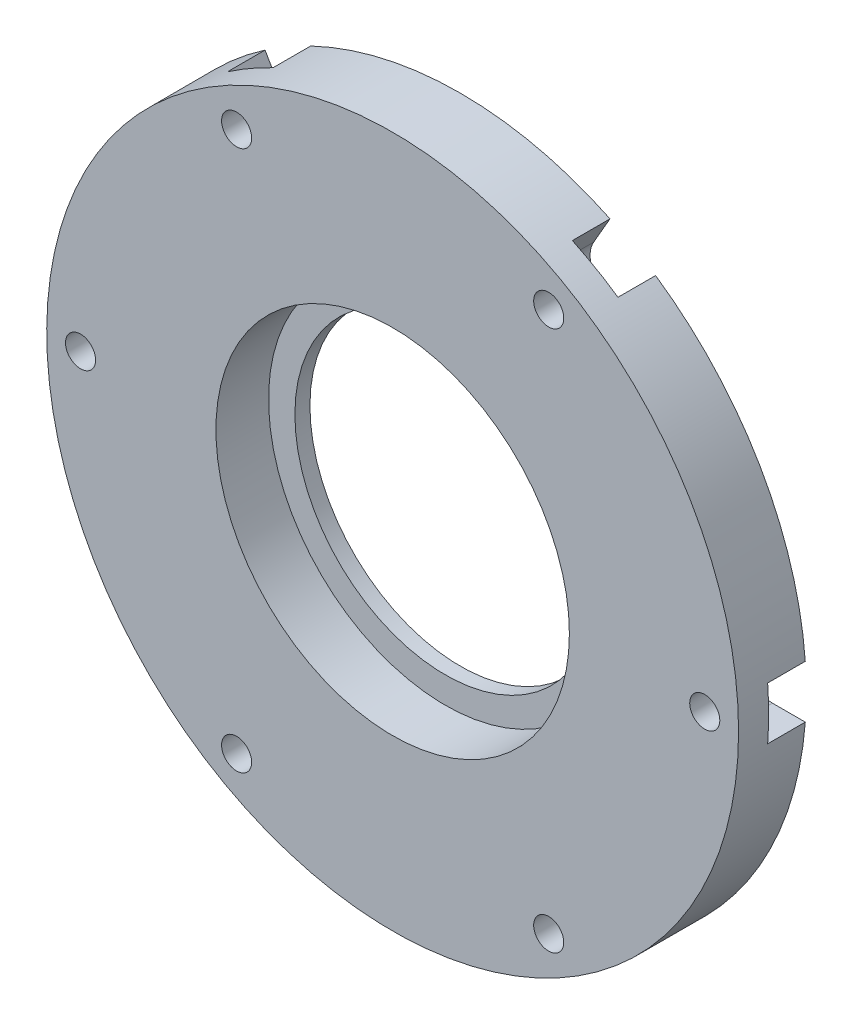
ISO-10303-21;
HEADER;
FILE_DESCRIPTION(('STEP AP214'),'2;1');
FILE_NAME('part.step','',(''),(''),'','','');
FILE_SCHEMA(('AUTOMOTIVE_DESIGN { 1 0 10303 214 1 1 1 1 }'));
ENDSEC;
DATA;
#1=APPLICATION_CONTEXT('core data for automotive mechanical design processes');
#2=APPLICATION_PROTOCOL_DEFINITION('international standard','automotive_design',2000,#1);
#3=PRODUCT_CONTEXT('',#1,'mechanical');
#4=PRODUCT('Part','Part','',(#3));
#5=PRODUCT_RELATED_PRODUCT_CATEGORY('part','',(#4));
#6=PRODUCT_DEFINITION_FORMATION('','',#4);
#7=PRODUCT_DEFINITION_CONTEXT('part definition',#1,'design');
#8=PRODUCT_DEFINITION('design','',#6,#7);
#9=PRODUCT_DEFINITION_SHAPE('','',#8);
#10=(LENGTH_UNIT() NAMED_UNIT(*) SI_UNIT(.MILLI.,.METRE.));
#11=(NAMED_UNIT(*) PLANE_ANGLE_UNIT() SI_UNIT($,.RADIAN.));
#12=(NAMED_UNIT(*) SI_UNIT($,.STERADIAN.) SOLID_ANGLE_UNIT());
#13=UNCERTAINTY_MEASURE_WITH_UNIT(LENGTH_MEASURE(1.E-05),#10,'distance_accuracy_value','');
#14=(GEOMETRIC_REPRESENTATION_CONTEXT(3) GLOBAL_UNCERTAINTY_ASSIGNED_CONTEXT((#13)) GLOBAL_UNIT_ASSIGNED_CONTEXT((#10,
#11,#12)) REPRESENTATION_CONTEXT('',''));
#15=CARTESIAN_POINT('',(0.,0.,0.));
#16=DIRECTION('',(0.,0.,1.));
#17=DIRECTION('',(1.,0.,0.));
#18=AXIS2_PLACEMENT_3D('',#15,#16,#17);
#19=CARTESIAN_POINT('',(0.,0.,0.));
#20=DIRECTION('',(0.,0.,1.));
#21=DIRECTION('',(1.,0.,0.));
#22=AXIS2_PLACEMENT_3D('',#19,#20,#21);
#23=PLANE('',#22);
#24=CARTESIAN_POINT('',(0.,0.,0.));
#25=DIRECTION('',(0.,0.,1.));
#26=DIRECTION('',(1.,0.,0.));
#27=AXIS2_PLACEMENT_3D('',#24,#25,#26);
#28=CIRCLE('',#27,20.);
#29=CARTESIAN_POINT('',(20.,0.,0.));
#30=VERTEX_POINT('',#29);
#31=EDGE_CURVE('E241',#30,#30,#28,.T.);
#32=ORIENTED_EDGE('',*,*,#31,.T.);
#33=EDGE_LOOP('',(#32));
#34=FACE_BOUND('',#33,.T.);
#35=DIRECTION('',(1.,0.,0.));
#36=VECTOR('',#35,1.);
#37=CARTESIAN_POINT('',(0.,-3.5,0.));
#38=LINE('',#37,#36);
#39=CARTESIAN_POINT('',(41.5,-3.49999999999952,0.));
#40=VERTEX_POINT('',#39);
#41=CARTESIAN_POINT('',(45.866654554262,-3.49999999999947,0.));
#42=VERTEX_POINT('',#41);
#43=EDGE_CURVE('E211',#40,#42,#38,.T.);
#44=ORIENTED_EDGE('',*,*,#43,.T.);
#45=CARTESIAN_POINT('',(0.,0.,0.));
#46=DIRECTION('',(0.,0.,1.));
#47=DIRECTION('',(1.,0.,0.));
#48=AXIS2_PLACEMENT_3D('',#45,#46,#47);
#49=CIRCLE('',#48,46.);
#50=CARTESIAN_POINT('',(25.9644161903769,-37.9716880305958,0.));
#51=VERTEX_POINT('',#50);
#52=EDGE_CURVE('E270',#51,#42,#49,.T.);
#53=ORIENTED_EDGE('',*,*,#52,.F.);
#54=DIRECTION('',(0.500000000000009,-0.866025403784434,0.));
#55=VECTOR('',#54,1.);
#56=CARTESIAN_POINT('',(3.03108891324549,1.75000000000002,0.));
#57=LINE('',#56,#55);
#58=CARTESIAN_POINT('',(23.7810889132459,-34.190054257054,0.));
#59=VERTEX_POINT('',#58);
#60=EDGE_CURVE('E674',#59,#51,#57,.T.);
#61=ORIENTED_EDGE('',*,*,#60,.F.);
#62=CARTESIAN_POINT('',(20.75,-35.9400542570542,0.));
#63=DIRECTION('',(0.,0.,-1.));
#64=DIRECTION('',(-1.,0.,0.));
#65=AXIS2_PLACEMENT_3D('',#62,#63,#64);
#66=CIRCLE('',#65,3.5);
#67=CARTESIAN_POINT('',(17.7189110867548,-37.690054257054,0.));
#68=VERTEX_POINT('',#67);
#69=EDGE_CURVE('E225',#68,#59,#66,.T.);
#70=ORIENTED_EDGE('',*,*,#69,.F.);
#71=DIRECTION('',(0.500000000000008,-0.866025403784434,0.));
#72=VECTOR('',#71,1.);
#73=CARTESIAN_POINT('',(-3.03108891324552,-1.75000000000003,0.));
#74=LINE('',#73,#72);
#75=CARTESIAN_POINT('',(19.9022383638858,-41.4716880305959,0.));
#76=VERTEX_POINT('',#75);
#77=EDGE_CURVE('E665',#68,#76,#74,.T.);
#78=ORIENTED_EDGE('',*,*,#77,.T.);
#79=CARTESIAN_POINT('',(-19.9022383638851,-41.4716880305962,0.));
#80=VERTEX_POINT('',#79);
#81=EDGE_CURVE('E831',#80,#76,#49,.T.);
#82=ORIENTED_EDGE('',*,*,#81,.F.);
#83=DIRECTION('',(-0.499999999999994,-0.866025403784442,0.));
#84=VECTOR('',#83,1.);
#85=CARTESIAN_POINT('',(3.03108891324555,-1.74999999999998,0.));
#86=LINE('',#85,#84);
#87=CARTESIAN_POINT('',(-17.7189110867542,-37.6900542570543,0.));
#88=VERTEX_POINT('',#87);
#89=EDGE_CURVE('E678',#88,#80,#86,.T.);
#90=ORIENTED_EDGE('',*,*,#89,.F.);
#91=CARTESIAN_POINT('',(-20.75,-35.9400542570542,0.));
#92=DIRECTION('',(0.,0.,-1.));
#93=DIRECTION('',(-1.,0.,0.));
#94=AXIS2_PLACEMENT_3D('',#91,#92,#93);
#95=CIRCLE('',#94,3.5);
#96=CARTESIAN_POINT('',(-23.7810889132453,-34.1900542570544,0.));
#97=VERTEX_POINT('',#96);
#98=EDGE_CURVE('E796',#97,#88,#95,.T.);
#99=ORIENTED_EDGE('',*,*,#98,.F.);
#100=DIRECTION('',(-0.499999999999994,-0.866025403784442,0.));
#101=VECTOR('',#100,1.);
#102=CARTESIAN_POINT('',(-3.03108891324554,1.74999999999998,0.));
#103=LINE('',#102,#101);
#104=CARTESIAN_POINT('',(-25.9644161903762,-37.9716880305963,0.));
#105=VERTEX_POINT('',#104);
#106=EDGE_CURVE('E766',#97,#105,#103,.T.);
#107=ORIENTED_EDGE('',*,*,#106,.T.);
#108=CARTESIAN_POINT('',(-45.8666545542619,-3.50000000000023,0.));
#109=VERTEX_POINT('',#108);
#110=EDGE_CURVE('E827',#109,#105,#49,.T.);
#111=ORIENTED_EDGE('',*,*,#110,.F.);
#112=DIRECTION('',(-1.,0.,0.));
#113=VECTOR('',#112,1.);
#114=CARTESIAN_POINT('',(0.,-3.50000000000002,0.));
#115=LINE('',#114,#113);
#116=CARTESIAN_POINT('',(-41.5,-3.50000000000021,0.));
#117=VERTEX_POINT('',#116);
#118=EDGE_CURVE('E749',#117,#109,#115,.T.);
#119=ORIENTED_EDGE('',*,*,#118,.F.);
#120=CARTESIAN_POINT('',(-41.5,0.,0.));
#121=DIRECTION('',(0.,0.,-1.));
#122=DIRECTION('',(-1.,0.,0.));
#123=AXIS2_PLACEMENT_3D('',#120,#121,#122);
#124=CIRCLE('',#123,3.5);
#125=CARTESIAN_POINT('',(-41.5,3.4999999999998,0.));
#126=VERTEX_POINT('',#125);
#127=EDGE_CURVE('E790',#126,#117,#124,.T.);
#128=ORIENTED_EDGE('',*,*,#127,.F.);
#129=DIRECTION('',(-1.,0.,0.));
#130=VECTOR('',#129,1.);
#131=CARTESIAN_POINT('',(0.,3.49999999999999,0.));
#132=LINE('',#131,#130);
#133=CARTESIAN_POINT('',(-45.866654554262,3.49999999999978,0.));
#134=VERTEX_POINT('',#133);
#135=EDGE_CURVE('E743',#126,#134,#132,.T.);
#136=ORIENTED_EDGE('',*,*,#135,.T.);
#137=CARTESIAN_POINT('',(-25.9644161903766,37.971688030596,0.));
#138=VERTEX_POINT('',#137);
#139=EDGE_CURVE('E825',#138,#134,#49,.T.);
#140=ORIENTED_EDGE('',*,*,#139,.F.);
#141=DIRECTION('',(-0.5,0.866025403784438,0.));
#142=VECTOR('',#141,1.);
#143=CARTESIAN_POINT('',(-3.03108891324561,-1.75000000000004,0.));
#144=LINE('',#143,#142);
#145=CARTESIAN_POINT('',(-23.7810889132456,34.1900542570541,0.));
#146=VERTEX_POINT('',#145);
#147=EDGE_CURVE('E726',#146,#138,#144,.T.);
#148=ORIENTED_EDGE('',*,*,#147,.F.);
#149=CARTESIAN_POINT('',(-20.75,35.9400542570542,0.));
#150=DIRECTION('',(0.,0.,-1.));
#151=DIRECTION('',(-1.,0.,0.));
#152=AXIS2_PLACEMENT_3D('',#149,#150,#151);
#153=CIRCLE('',#152,3.5);
#154=CARTESIAN_POINT('',(-17.7189110867545,37.6900542570542,0.));
#155=VERTEX_POINT('',#154);
#156=EDGE_CURVE('E784',#155,#146,#153,.T.);
#157=ORIENTED_EDGE('',*,*,#156,.F.);
#158=DIRECTION('',(-0.500000000000002,0.866025403784437,0.));
#159=VECTOR('',#158,1.);
#160=CARTESIAN_POINT('',(3.03108891324554,1.75000000000001,0.));
#161=LINE('',#160,#159);
#162=CARTESIAN_POINT('',(-19.9022383638855,41.471688030596,0.));
#163=VERTEX_POINT('',#162);
#164=EDGE_CURVE('E722',#155,#163,#161,.T.);
#165=ORIENTED_EDGE('',*,*,#164,.T.);
#166=CARTESIAN_POINT('',(19.9022383638854,41.4716880305961,0.));
#167=VERTEX_POINT('',#166);
#168=EDGE_CURVE('E274',#167,#163,#49,.T.);
#169=ORIENTED_EDGE('',*,*,#168,.F.);
#170=DIRECTION('',(0.5,0.866025403784439,0.));
#171=VECTOR('',#170,1.);
#172=CARTESIAN_POINT('',(-3.03108891324553,1.75,0.));
#173=LINE('',#172,#171);
#174=CARTESIAN_POINT('',(17.7189110867545,37.6900542570542,0.));
#175=VERTEX_POINT('',#174);
#176=EDGE_CURVE('E697',#175,#167,#173,.T.);
#177=ORIENTED_EDGE('',*,*,#176,.F.);
#178=CARTESIAN_POINT('',(20.75,35.9400542570542,0.));
#179=DIRECTION('',(0.,0.,-1.));
#180=DIRECTION('',(-1.,0.,0.));
#181=AXIS2_PLACEMENT_3D('',#178,#179,#180);
#182=CIRCLE('',#181,3.5);
#183=CARTESIAN_POINT('',(23.7810889132455,34.1900542570542,0.));
#184=VERTEX_POINT('',#183);
#185=EDGE_CURVE('E237',#184,#175,#182,.T.);
#186=ORIENTED_EDGE('',*,*,#185,.F.);
#187=DIRECTION('',(0.5,0.866025403784439,0.));
#188=VECTOR('',#187,1.);
#189=CARTESIAN_POINT('',(3.03108891324554,-1.75,0.));
#190=LINE('',#189,#188);
#191=CARTESIAN_POINT('',(25.9644161903765,37.9716880305961,0.));
#192=VERTEX_POINT('',#191);
#193=EDGE_CURVE('E703',#184,#192,#190,.T.);
#194=ORIENTED_EDGE('',*,*,#193,.T.);
#195=CARTESIAN_POINT('',(45.8666545542619,3.50000000000054,0.));
#196=VERTEX_POINT('',#195);
#197=EDGE_CURVE('E44',#196,#192,#49,.T.);
#198=ORIENTED_EDGE('',*,*,#197,.F.);
#199=DIRECTION('',(1.,0.,0.));
#200=VECTOR('',#199,1.);
#201=CARTESIAN_POINT('',(0.,3.50000000000001,0.));
#202=LINE('',#201,#200);
#203=CARTESIAN_POINT('',(41.5,3.50000000000049,0.));
#204=VERTEX_POINT('',#203);
#205=EDGE_CURVE('E710',#204,#196,#202,.T.);
#206=ORIENTED_EDGE('',*,*,#205,.F.);
#207=CARTESIAN_POINT('',(41.5,0.,0.));
#208=DIRECTION('',(0.,0.,-1.));
#209=DIRECTION('',(-1.,0.,0.));
#210=AXIS2_PLACEMENT_3D('',#207,#208,#209);
#211=CIRCLE('',#210,3.5);
#212=EDGE_CURVE('E220',#40,#204,#211,.T.);
#213=ORIENTED_EDGE('',*,*,#212,.F.);
#214=EDGE_LOOP('',(#44,#53,#61,#70,#78,#82,#90,#99,#107,#111,#119,#128,#136,#140,#148,#157,#165,
#169,#177,#186,#194,#198,#206,#213));
#215=FACE_BOUND('',#214,.T.);
#216=ADVANCED_FACE('F35',(#34,#215),#23,.F.);
#217=CARTESIAN_POINT('',(0.,0.,9.));
#218=DIRECTION('',(0.,0.,-1.));
#219=DIRECTION('',(-1.,0.,0.));
#220=AXIS2_PLACEMENT_3D('',#217,#218,#219);
#221=CYLINDRICAL_SURFACE('',#220,46.);
#222=CARTESIAN_POINT('',(0.,0.,9.));
#223=DIRECTION('',(0.,0.,1.));
#224=DIRECTION('',(1.,0.,0.));
#225=AXIS2_PLACEMENT_3D('',#222,#223,#224);
#226=CIRCLE('',#225,46.);
#227=CARTESIAN_POINT('',(46.,0.,9.));
#228=VERTEX_POINT('',#227);
#229=EDGE_CURVE('E11',#228,#228,#226,.T.);
#230=ORIENTED_EDGE('',*,*,#229,.F.);
#231=EDGE_LOOP('',(#230));
#232=FACE_BOUND('',#231,.T.);
#233=DIRECTION('',(0.,0.,-1.));
#234=VECTOR('',#233,1.);
#235=CARTESIAN_POINT('',(45.866654554262,-3.49999999999947,5.));
#236=LINE('',#235,#234);
#237=CARTESIAN_POINT('',(45.866654554262,-3.49999999999947,5.));
#238=VERTEX_POINT('',#237);
#239=EDGE_CURVE('E806',#238,#42,#236,.T.);
#240=ORIENTED_EDGE('',*,*,#239,.F.);
#241=CARTESIAN_POINT('',(0.,0.,5.));
#242=DIRECTION('',(0.,0.,-1.));
#243=DIRECTION('',(-1.,0.,0.));
#244=AXIS2_PLACEMENT_3D('',#241,#242,#243);
#245=CIRCLE('',#244,46.);
#246=CARTESIAN_POINT('',(45.8666545542619,3.50000000000054,5.));
#247=VERTEX_POINT('',#246);
#248=EDGE_CURVE('E210',#247,#238,#245,.T.);
#249=ORIENTED_EDGE('',*,*,#248,.F.);
#250=DIRECTION('',(0.,0.,-1.));
#251=VECTOR('',#250,1.);
#252=CARTESIAN_POINT('',(45.8666545542619,3.50000000000054,5.));
#253=LINE('',#252,#251);
#254=EDGE_CURVE('E205',#247,#196,#253,.T.);
#255=ORIENTED_EDGE('',*,*,#254,.T.);
#256=ORIENTED_EDGE('',*,*,#197,.T.);
#257=DIRECTION('',(0.,0.,-1.));
#258=VECTOR('',#257,1.);
#259=CARTESIAN_POINT('',(25.9644161903765,37.9716880305961,5.));
#260=LINE('',#259,#258);
#261=CARTESIAN_POINT('',(25.9644161903765,37.9716880305961,5.));
#262=VERTEX_POINT('',#261);
#263=EDGE_CURVE('E708',#262,#192,#260,.T.);
#264=ORIENTED_EDGE('',*,*,#263,.F.);
#265=CARTESIAN_POINT('',(0.,0.,5.));
#266=DIRECTION('',(0.,0.,-1.));
#267=DIRECTION('',(-1.,0.,0.));
#268=AXIS2_PLACEMENT_3D('',#265,#266,#267);
#269=CIRCLE('',#268,46.);
#270=CARTESIAN_POINT('',(19.9022383638854,41.4716880305961,5.));
#271=VERTEX_POINT('',#270);
#272=EDGE_CURVE('E700',#271,#262,#269,.T.);
#273=ORIENTED_EDGE('',*,*,#272,.F.);
#274=DIRECTION('',(0.,0.,-1.));
#275=VECTOR('',#274,1.);
#276=CARTESIAN_POINT('',(19.9022383638854,41.4716880305961,5.));
#277=LINE('',#276,#275);
#278=EDGE_CURVE('E711',#271,#167,#277,.T.);
#279=ORIENTED_EDGE('',*,*,#278,.T.);
#280=ORIENTED_EDGE('',*,*,#168,.T.);
#281=DIRECTION('',(0.,0.,-1.));
#282=VECTOR('',#281,1.);
#283=CARTESIAN_POINT('',(-19.9022383638855,41.471688030596,5.));
#284=LINE('',#283,#282);
#285=CARTESIAN_POINT('',(-19.9022383638855,41.471688030596,5.));
#286=VERTEX_POINT('',#285);
#287=EDGE_CURVE('E733',#286,#163,#284,.T.);
#288=ORIENTED_EDGE('',*,*,#287,.F.);
#289=CARTESIAN_POINT('',(0.,0.,5.));
#290=DIRECTION('',(0.,0.,-1.));
#291=DIRECTION('',(-1.,0.,0.));
#292=AXIS2_PLACEMENT_3D('',#289,#290,#291);
#293=CIRCLE('',#292,46.);
#294=CARTESIAN_POINT('',(-25.9644161903766,37.971688030596,5.));
#295=VERTEX_POINT('',#294);
#296=EDGE_CURVE('E721',#295,#286,#293,.T.);
#297=ORIENTED_EDGE('',*,*,#296,.F.);
#298=DIRECTION('',(0.,0.,-1.));
#299=VECTOR('',#298,1.);
#300=CARTESIAN_POINT('',(-25.9644161903766,37.971688030596,5.));
#301=LINE('',#300,#299);
#302=EDGE_CURVE('E735',#295,#138,#301,.T.);
#303=ORIENTED_EDGE('',*,*,#302,.T.);
#304=ORIENTED_EDGE('',*,*,#139,.T.);
#305=DIRECTION('',(0.,0.,-1.));
#306=VECTOR('',#305,1.);
#307=CARTESIAN_POINT('',(-45.866654554262,3.49999999999978,5.));
#308=LINE('',#307,#306);
#309=CARTESIAN_POINT('',(-45.866654554262,3.49999999999978,5.));
#310=VERTEX_POINT('',#309);
#311=EDGE_CURVE('E756',#310,#134,#308,.T.);
#312=ORIENTED_EDGE('',*,*,#311,.F.);
#313=CARTESIAN_POINT('',(0.,0.,5.));
#314=DIRECTION('',(0.,0.,-1.));
#315=DIRECTION('',(-1.,0.,0.));
#316=AXIS2_PLACEMENT_3D('',#313,#314,#315);
#317=CIRCLE('',#316,46.);
#318=CARTESIAN_POINT('',(-45.8666545542619,-3.50000000000023,5.));
#319=VERTEX_POINT('',#318);
#320=EDGE_CURVE('E742',#319,#310,#317,.T.);
#321=ORIENTED_EDGE('',*,*,#320,.F.);
#322=DIRECTION('',(0.,0.,-1.));
#323=VECTOR('',#322,1.);
#324=CARTESIAN_POINT('',(-45.8666545542619,-3.50000000000023,5.));
#325=LINE('',#324,#323);
#326=EDGE_CURVE('E758',#319,#109,#325,.T.);
#327=ORIENTED_EDGE('',*,*,#326,.T.);
#328=ORIENTED_EDGE('',*,*,#110,.T.);
#329=DIRECTION('',(0.,0.,-1.));
#330=VECTOR('',#329,1.);
#331=CARTESIAN_POINT('',(-25.9644161903762,-37.9716880305963,5.));
#332=LINE('',#331,#330);
#333=CARTESIAN_POINT('',(-25.9644161903762,-37.9716880305963,5.));
#334=VERTEX_POINT('',#333);
#335=EDGE_CURVE('E777',#334,#105,#332,.T.);
#336=ORIENTED_EDGE('',*,*,#335,.F.);
#337=CARTESIAN_POINT('',(0.,0.,5.));
#338=DIRECTION('',(0.,0.,-1.));
#339=DIRECTION('',(-1.,0.,0.));
#340=AXIS2_PLACEMENT_3D('',#337,#338,#339);
#341=CIRCLE('',#340,46.);
#342=CARTESIAN_POINT('',(-19.9022383638851,-41.4716880305962,5.));
#343=VERTEX_POINT('',#342);
#344=EDGE_CURVE('E765',#343,#334,#341,.T.);
#345=ORIENTED_EDGE('',*,*,#344,.F.);
#346=DIRECTION('',(0.,0.,-1.));
#347=VECTOR('',#346,1.);
#348=CARTESIAN_POINT('',(-19.9022383638851,-41.4716880305962,5.));
#349=LINE('',#348,#347);
#350=EDGE_CURVE('E779',#343,#80,#349,.T.);
#351=ORIENTED_EDGE('',*,*,#350,.T.);
#352=ORIENTED_EDGE('',*,*,#81,.T.);
#353=DIRECTION('',(0.,0.,-1.));
#354=VECTOR('',#353,1.);
#355=CARTESIAN_POINT('',(19.9022383638858,-41.4716880305959,5.));
#356=LINE('',#355,#354);
#357=CARTESIAN_POINT('',(19.9022383638858,-41.4716880305959,5.));
#358=VERTEX_POINT('',#357);
#359=EDGE_CURVE('E669',#358,#76,#356,.T.);
#360=ORIENTED_EDGE('',*,*,#359,.F.);
#361=CARTESIAN_POINT('',(0.,0.,5.));
#362=DIRECTION('',(0.,0.,-1.));
#363=DIRECTION('',(-1.,0.,0.));
#364=AXIS2_PLACEMENT_3D('',#361,#362,#363);
#365=CIRCLE('',#364,46.);
#366=CARTESIAN_POINT('',(25.9644161903769,-37.9716880305958,5.));
#367=VERTEX_POINT('',#366);
#368=EDGE_CURVE('E802',#367,#358,#365,.T.);
#369=ORIENTED_EDGE('',*,*,#368,.F.);
#370=DIRECTION('',(0.,0.,-1.));
#371=VECTOR('',#370,1.);
#372=CARTESIAN_POINT('',(25.9644161903769,-37.9716880305958,5.));
#373=LINE('',#372,#371);
#374=EDGE_CURVE('E691',#367,#51,#373,.T.);
#375=ORIENTED_EDGE('',*,*,#374,.T.);
#376=ORIENTED_EDGE('',*,*,#52,.T.);
#377=EDGE_LOOP('',(#240,#249,#255,#256,#264,#273,#279,#280,#288,#297,#303,#304,#312,#321,#327,
#328,#336,#345,#351,#352,#360,#369,#375,#376));
#378=FACE_BOUND('',#377,.T.);
#379=ADVANCED_FACE('F37',(#232,#378),#221,.T.);
#380=CARTESIAN_POINT('',(20.75,35.9400542570542,5.));
#381=DIRECTION('',(0.,0.,-1.));
#382=DIRECTION('',(-1.,0.,0.));
#383=AXIS2_PLACEMENT_3D('',#380,#381,#382);
#384=CYLINDRICAL_SURFACE('',#383,3.5);
#385=DIRECTION('',(0.,0.,-1.));
#386=VECTOR('',#385,1.);
#387=CARTESIAN_POINT('',(23.7810889132455,34.1900542570542,5.));
#388=LINE('',#387,#386);
#389=CARTESIAN_POINT('',(23.7810889132455,34.1900542570542,5.));
#390=VERTEX_POINT('',#389);
#391=EDGE_CURVE('E702',#390,#184,#388,.T.);
#392=ORIENTED_EDGE('',*,*,#391,.T.);
#393=ORIENTED_EDGE('',*,*,#185,.T.);
#394=DIRECTION('',(0.,0.,-1.));
#395=VECTOR('',#394,1.);
#396=CARTESIAN_POINT('',(17.7189110867545,37.6900542570542,5.));
#397=LINE('',#396,#395);
#398=CARTESIAN_POINT('',(17.7189110867545,37.6900542570542,5.));
#399=VERTEX_POINT('',#398);
#400=EDGE_CURVE('E714',#399,#175,#397,.T.);
#401=ORIENTED_EDGE('',*,*,#400,.F.);
#402=CARTESIAN_POINT('',(20.75,35.9400542570542,5.));
#403=DIRECTION('',(0.,0.,-1.));
#404=DIRECTION('',(-1.,0.,0.));
#405=AXIS2_PLACEMENT_3D('',#402,#403,#404);
#406=CIRCLE('',#405,3.5);
#407=EDGE_CURVE('E234',#390,#399,#406,.T.);
#408=ORIENTED_EDGE('',*,*,#407,.F.);
#409=EDGE_LOOP('',(#392,#393,#401,#408));
#410=FACE_BOUND('',#409,.T.);
#411=ADVANCED_FACE('F314',(#410),#384,.F.);
#412=CARTESIAN_POINT('',(-20.75,35.9400542570542,5.));
#413=DIRECTION('',(0.,0.,-1.));
#414=DIRECTION('',(-1.,0.,0.));
#415=AXIS2_PLACEMENT_3D('',#412,#413,#414);
#416=CYLINDRICAL_SURFACE('',#415,3.5);
#417=DIRECTION('',(0.,0.,-1.));
#418=VECTOR('',#417,1.);
#419=CARTESIAN_POINT('',(-17.7189110867545,37.6900542570542,5.));
#420=LINE('',#419,#418);
#421=CARTESIAN_POINT('',(-17.7189110867546,37.6900542570542,5.));
#422=VERTEX_POINT('',#421);
#423=EDGE_CURVE('E706',#422,#155,#420,.T.);
#424=ORIENTED_EDGE('',*,*,#423,.T.);
#425=ORIENTED_EDGE('',*,*,#156,.T.);
#426=DIRECTION('',(0.,0.,-1.));
#427=VECTOR('',#426,1.);
#428=CARTESIAN_POINT('',(-23.7810889132456,34.1900542570541,5.));
#429=LINE('',#428,#427);
#430=CARTESIAN_POINT('',(-23.7810889132456,34.1900542570541,5.));
#431=VERTEX_POINT('',#430);
#432=EDGE_CURVE('E725',#431,#146,#429,.T.);
#433=ORIENTED_EDGE('',*,*,#432,.F.);
#434=CARTESIAN_POINT('',(-20.75,35.9400542570542,5.));
#435=DIRECTION('',(0.,0.,-1.));
#436=DIRECTION('',(-1.,0.,0.));
#437=AXIS2_PLACEMENT_3D('',#434,#435,#436);
#438=CIRCLE('',#437,3.5);
#439=EDGE_CURVE('E240',#422,#431,#438,.T.);
#440=ORIENTED_EDGE('',*,*,#439,.F.);
#441=EDGE_LOOP('',(#424,#425,#433,#440));
#442=FACE_BOUND('',#441,.T.);
#443=ADVANCED_FACE('F360',(#442),#416,.F.);
#444=CARTESIAN_POINT('',(-41.5,0.,5.));
#445=DIRECTION('',(0.,0.,-1.));
#446=DIRECTION('',(-1.,0.,0.));
#447=AXIS2_PLACEMENT_3D('',#444,#445,#446);
#448=CYLINDRICAL_SURFACE('',#447,3.5);
#449=DIRECTION('',(0.,0.,-1.));
#450=VECTOR('',#449,1.);
#451=CARTESIAN_POINT('',(-41.5,3.4999999999998,5.));
#452=LINE('',#451,#450);
#453=CARTESIAN_POINT('',(-41.5,3.4999999999998,5.));
#454=VERTEX_POINT('',#453);
#455=EDGE_CURVE('E728',#454,#126,#452,.T.);
#456=ORIENTED_EDGE('',*,*,#455,.T.);
#457=ORIENTED_EDGE('',*,*,#127,.T.);
#458=DIRECTION('',(0.,0.,-1.));
#459=VECTOR('',#458,1.);
#460=CARTESIAN_POINT('',(-41.5,-3.50000000000021,5.));
#461=LINE('',#460,#459);
#462=CARTESIAN_POINT('',(-41.5,-3.50000000000021,5.));
#463=VERTEX_POINT('',#462);
#464=EDGE_CURVE('E748',#463,#117,#461,.T.);
#465=ORIENTED_EDGE('',*,*,#464,.F.);
#466=CARTESIAN_POINT('',(-41.5,0.,5.));
#467=DIRECTION('',(0.,0.,-1.));
#468=DIRECTION('',(-1.,0.,0.));
#469=AXIS2_PLACEMENT_3D('',#466,#467,#468);
#470=CIRCLE('',#469,3.5);
#471=EDGE_CURVE('E787',#454,#463,#470,.T.);
#472=ORIENTED_EDGE('',*,*,#471,.F.);
#473=EDGE_LOOP('',(#456,#457,#465,#472));
#474=FACE_BOUND('',#473,.T.);
#475=ADVANCED_FACE('F375',(#474),#448,.F.);
#476=CARTESIAN_POINT('',(-20.75,-35.9400542570542,5.));
#477=DIRECTION('',(0.,0.,-1.));
#478=DIRECTION('',(-1.,0.,0.));
#479=AXIS2_PLACEMENT_3D('',#476,#477,#478);
#480=CYLINDRICAL_SURFACE('',#479,3.5);
#481=DIRECTION('',(0.,0.,-1.));
#482=VECTOR('',#481,1.);
#483=CARTESIAN_POINT('',(-23.7810889132453,-34.1900542570544,5.));
#484=LINE('',#483,#482);
#485=CARTESIAN_POINT('',(-23.7810889132453,-34.1900542570544,5.));
#486=VERTEX_POINT('',#485);
#487=EDGE_CURVE('E751',#486,#97,#484,.T.);
#488=ORIENTED_EDGE('',*,*,#487,.T.);
#489=ORIENTED_EDGE('',*,*,#98,.T.);
#490=DIRECTION('',(0.,0.,-1.));
#491=VECTOR('',#490,1.);
#492=CARTESIAN_POINT('',(-17.7189110867542,-37.6900542570543,5.));
#493=LINE('',#492,#491);
#494=CARTESIAN_POINT('',(-17.7189110867542,-37.6900542570543,5.));
#495=VERTEX_POINT('',#494);
#496=EDGE_CURVE('E771',#495,#88,#493,.T.);
#497=ORIENTED_EDGE('',*,*,#496,.F.);
#498=CARTESIAN_POINT('',(-20.75,-35.9400542570542,5.));
#499=DIRECTION('',(0.,0.,-1.));
#500=DIRECTION('',(-1.,0.,0.));
#501=AXIS2_PLACEMENT_3D('',#498,#499,#500);
#502=CIRCLE('',#501,3.5);
#503=EDGE_CURVE('E793',#486,#495,#502,.T.);
#504=ORIENTED_EDGE('',*,*,#503,.F.);
#505=EDGE_LOOP('',(#488,#489,#497,#504));
#506=FACE_BOUND('',#505,.T.);
#507=ADVANCED_FACE('F370',(#506),#480,.F.);
#508=CARTESIAN_POINT('',(20.75,-35.9400542570542,5.));
#509=DIRECTION('',(0.,0.,-1.));
#510=DIRECTION('',(-1.,0.,0.));
#511=AXIS2_PLACEMENT_3D('',#508,#509,#510);
#512=CYLINDRICAL_SURFACE('',#511,3.5);
#513=DIRECTION('',(0.,0.,-1.));
#514=VECTOR('',#513,1.);
#515=CARTESIAN_POINT('',(17.7189110867548,-37.690054257054,5.));
#516=LINE('',#515,#514);
#517=CARTESIAN_POINT('',(17.7189110867548,-37.690054257054,5.));
#518=VERTEX_POINT('',#517);
#519=EDGE_CURVE('E666',#518,#68,#516,.T.);
#520=ORIENTED_EDGE('',*,*,#519,.T.);
#521=ORIENTED_EDGE('',*,*,#69,.T.);
#522=DIRECTION('',(0.,0.,-1.));
#523=VECTOR('',#522,1.);
#524=CARTESIAN_POINT('',(23.7810889132459,-34.190054257054,5.));
#525=LINE('',#524,#523);
#526=CARTESIAN_POINT('',(23.7810889132459,-34.190054257054,5.));
#527=VERTEX_POINT('',#526);
#528=EDGE_CURVE('E693',#527,#59,#525,.T.);
#529=ORIENTED_EDGE('',*,*,#528,.F.);
#530=CARTESIAN_POINT('',(20.75,-35.9400542570542,5.));
#531=DIRECTION('',(0.,0.,-1.));
#532=DIRECTION('',(-1.,0.,0.));
#533=AXIS2_PLACEMENT_3D('',#530,#531,#532);
#534=CIRCLE('',#533,3.5);
#535=EDGE_CURVE('E228',#518,#527,#534,.T.);
#536=ORIENTED_EDGE('',*,*,#535,.F.);
#537=EDGE_LOOP('',(#520,#521,#529,#536));
#538=FACE_BOUND('',#537,.T.);
#539=ADVANCED_FACE('F366',(#538),#512,.F.);
#540=CARTESIAN_POINT('',(41.5,0.,5.));
#541=DIRECTION('',(0.,0.,-1.));
#542=DIRECTION('',(-1.,0.,0.));
#543=AXIS2_PLACEMENT_3D('',#540,#541,#542);
#544=CYLINDRICAL_SURFACE('',#543,3.5);
#545=DIRECTION('',(0.,0.,-1.));
#546=VECTOR('',#545,1.);
#547=CARTESIAN_POINT('',(41.5,-3.49999999999952,5.));
#548=LINE('',#547,#546);
#549=CARTESIAN_POINT('',(41.5,-3.49999999999952,5.));
#550=VERTEX_POINT('',#549);
#551=EDGE_CURVE('E230',#550,#40,#548,.T.);
#552=ORIENTED_EDGE('',*,*,#551,.T.);
#553=ORIENTED_EDGE('',*,*,#212,.T.);
#554=DIRECTION('',(0.,0.,-1.));
#555=VECTOR('',#554,1.);
#556=CARTESIAN_POINT('',(41.5,3.50000000000049,5.));
#557=LINE('',#556,#555);
#558=CARTESIAN_POINT('',(41.5,3.50000000000049,5.));
#559=VERTEX_POINT('',#558);
#560=EDGE_CURVE('E202',#559,#204,#557,.T.);
#561=ORIENTED_EDGE('',*,*,#560,.F.);
#562=CARTESIAN_POINT('',(41.5,0.,5.));
#563=DIRECTION('',(0.,0.,-1.));
#564=DIRECTION('',(-1.,0.,0.));
#565=AXIS2_PLACEMENT_3D('',#562,#563,#564);
#566=CIRCLE('',#565,3.5);
#567=EDGE_CURVE('E218',#550,#559,#566,.T.);
#568=ORIENTED_EDGE('',*,*,#567,.F.);
#569=EDGE_LOOP('',(#552,#553,#561,#568));
#570=FACE_BOUND('',#569,.T.);
#571=ADVANCED_FACE('F217',(#570),#544,.F.);
#572=CARTESIAN_POINT('',(41.5,0.,9.));
#573=DIRECTION('',(0.,0.,-1.));
#574=DIRECTION('',(-1.,0.,0.));
#575=AXIS2_PLACEMENT_3D('',#572,#573,#574);
#576=CYLINDRICAL_SURFACE('',#575,2.);
#577=CARTESIAN_POINT('',(41.5,0.,9.));
#578=DIRECTION('',(0.,0.,1.));
#579=DIRECTION('',(1.,0.,0.));
#580=AXIS2_PLACEMENT_3D('',#577,#578,#579);
#581=CIRCLE('',#580,2.);
#582=CARTESIAN_POINT('',(43.5,0.,9.));
#583=VERTEX_POINT('',#582);
#584=EDGE_CURVE('E268',#583,#583,#581,.T.);
#585=ORIENTED_EDGE('',*,*,#584,.T.);
#586=EDGE_LOOP('',(#585));
#587=FACE_BOUND('',#586,.T.);
#588=CARTESIAN_POINT('',(41.5,0.,5.));
#589=DIRECTION('',(0.,0.,-1.));
#590=DIRECTION('',(-1.,0.,0.));
#591=AXIS2_PLACEMENT_3D('',#588,#589,#590);
#592=CIRCLE('',#591,2.);
#593=CARTESIAN_POINT('',(39.5,0.,5.));
#594=VERTEX_POINT('',#593);
#595=EDGE_CURVE('E39',#594,#594,#592,.T.);
#596=ORIENTED_EDGE('',*,*,#595,.T.);
#597=EDGE_LOOP('',(#596));
#598=FACE_BOUND('',#597,.T.);
#599=ADVANCED_FACE('F292',(#587,#598),#576,.F.);
#600=CARTESIAN_POINT('',(20.75,-35.9400542570542,9.));
#601=DIRECTION('',(0.,0.,-1.));
#602=DIRECTION('',(-1.,0.,0.));
#603=AXIS2_PLACEMENT_3D('',#600,#601,#602);
#604=CYLINDRICAL_SURFACE('',#603,2.00000000000001);
#605=CARTESIAN_POINT('',(20.75,-35.9400542570542,9.));
#606=DIRECTION('',(0.,0.,1.));
#607=DIRECTION('',(1.,0.,0.));
#608=AXIS2_PLACEMENT_3D('',#605,#606,#607);
#609=CIRCLE('',#608,2.00000000000001);
#610=CARTESIAN_POINT('',(22.75,-35.9400542570542,9.));
#611=VERTEX_POINT('',#610);
#612=EDGE_CURVE('E265',#611,#611,#609,.T.);
#613=ORIENTED_EDGE('',*,*,#612,.T.);
#614=EDGE_LOOP('',(#613));
#615=FACE_BOUND('',#614,.T.);
#616=CARTESIAN_POINT('',(20.75,-35.9400542570542,5.));
#617=DIRECTION('',(0.,0.,-1.));
#618=DIRECTION('',(-1.,0.,0.));
#619=AXIS2_PLACEMENT_3D('',#616,#617,#618);
#620=CIRCLE('',#619,2.00000000000001);
#621=CARTESIAN_POINT('',(18.75,-35.9400542570542,5.));
#622=VERTEX_POINT('',#621);
#623=EDGE_CURVE('E285',#622,#622,#620,.T.);
#624=ORIENTED_EDGE('',*,*,#623,.T.);
#625=EDGE_LOOP('',(#624));
#626=FACE_BOUND('',#625,.T.);
#627=ADVANCED_FACE('F326',(#615,#626),#604,.F.);
#628=CARTESIAN_POINT('',(-20.75,-35.9400542570542,9.));
#629=DIRECTION('',(0.,0.,-1.));
#630=DIRECTION('',(-1.,0.,0.));
#631=AXIS2_PLACEMENT_3D('',#628,#629,#630);
#632=CYLINDRICAL_SURFACE('',#631,2.);
#633=CARTESIAN_POINT('',(-20.75,-35.9400542570542,9.));
#634=DIRECTION('',(0.,0.,1.));
#635=DIRECTION('',(1.,0.,0.));
#636=AXIS2_PLACEMENT_3D('',#633,#634,#635);
#637=CIRCLE('',#636,2.);
#638=CARTESIAN_POINT('',(-18.75,-35.9400542570542,9.));
#639=VERTEX_POINT('',#638);
#640=EDGE_CURVE('E262',#639,#639,#637,.T.);
#641=ORIENTED_EDGE('',*,*,#640,.T.);
#642=EDGE_LOOP('',(#641));
#643=FACE_BOUND('',#642,.T.);
#644=CARTESIAN_POINT('',(-20.75,-35.9400542570542,5.));
#645=DIRECTION('',(0.,0.,-1.));
#646=DIRECTION('',(-1.,0.,0.));
#647=AXIS2_PLACEMENT_3D('',#644,#645,#646);
#648=CIRCLE('',#647,2.);
#649=CARTESIAN_POINT('',(-22.75,-35.9400542570542,5.));
#650=VERTEX_POINT('',#649);
#651=EDGE_CURVE('E283',#650,#650,#648,.T.);
#652=ORIENTED_EDGE('',*,*,#651,.T.);
#653=EDGE_LOOP('',(#652));
#654=FACE_BOUND('',#653,.T.);
#655=ADVANCED_FACE('F330',(#643,#654),#632,.F.);
#656=CARTESIAN_POINT('',(-41.5,0.,9.));
#657=DIRECTION('',(0.,0.,-1.));
#658=DIRECTION('',(-1.,0.,0.));
#659=AXIS2_PLACEMENT_3D('',#656,#657,#658);
#660=CYLINDRICAL_SURFACE('',#659,2.);
#661=CARTESIAN_POINT('',(-41.5,0.,9.));
#662=DIRECTION('',(0.,0.,1.));
#663=DIRECTION('',(1.,0.,0.));
#664=AXIS2_PLACEMENT_3D('',#661,#662,#663);
#665=CIRCLE('',#664,2.);
#666=CARTESIAN_POINT('',(-39.5,0.,9.));
#667=VERTEX_POINT('',#666);
#668=EDGE_CURVE('E259',#667,#667,#665,.T.);
#669=ORIENTED_EDGE('',*,*,#668,.T.);
#670=EDGE_LOOP('',(#669));
#671=FACE_BOUND('',#670,.T.);
#672=CARTESIAN_POINT('',(-41.5,0.,5.));
#673=DIRECTION('',(0.,0.,-1.));
#674=DIRECTION('',(-1.,0.,0.));
#675=AXIS2_PLACEMENT_3D('',#672,#673,#674);
#676=CIRCLE('',#675,2.);
#677=CARTESIAN_POINT('',(-43.5,0.,5.));
#678=VERTEX_POINT('',#677);
#679=EDGE_CURVE('E280',#678,#678,#676,.T.);
#680=ORIENTED_EDGE('',*,*,#679,.T.);
#681=EDGE_LOOP('',(#680));
#682=FACE_BOUND('',#681,.T.);
#683=ADVANCED_FACE('F334',(#671,#682),#660,.F.);
#684=CARTESIAN_POINT('',(-20.75,35.9400542570542,9.));
#685=DIRECTION('',(0.,0.,-1.));
#686=DIRECTION('',(-1.,0.,0.));
#687=AXIS2_PLACEMENT_3D('',#684,#685,#686);
#688=CYLINDRICAL_SURFACE('',#687,2.);
#689=CARTESIAN_POINT('',(-20.75,35.9400542570542,9.));
#690=DIRECTION('',(0.,0.,1.));
#691=DIRECTION('',(1.,0.,0.));
#692=AXIS2_PLACEMENT_3D('',#689,#690,#691);
#693=CIRCLE('',#692,2.);
#694=CARTESIAN_POINT('',(-18.75,35.9400542570542,9.));
#695=VERTEX_POINT('',#694);
#696=EDGE_CURVE('E256',#695,#695,#693,.T.);
#697=ORIENTED_EDGE('',*,*,#696,.T.);
#698=EDGE_LOOP('',(#697));
#699=FACE_BOUND('',#698,.T.);
#700=CARTESIAN_POINT('',(-20.75,35.9400542570542,5.));
#701=DIRECTION('',(0.,0.,-1.));
#702=DIRECTION('',(-1.,0.,0.));
#703=AXIS2_PLACEMENT_3D('',#700,#701,#702);
#704=CIRCLE('',#703,2.);
#705=CARTESIAN_POINT('',(-22.75,35.9400542570542,5.));
#706=VERTEX_POINT('',#705);
#707=EDGE_CURVE('E277',#706,#706,#704,.T.);
#708=ORIENTED_EDGE('',*,*,#707,.T.);
#709=EDGE_LOOP('',(#708));
#710=FACE_BOUND('',#709,.T.);
#711=ADVANCED_FACE('F338',(#699,#710),#688,.F.);
#712=CARTESIAN_POINT('',(20.75,35.9400542570542,9.));
#713=DIRECTION('',(0.,0.,-1.));
#714=DIRECTION('',(-1.,0.,0.));
#715=AXIS2_PLACEMENT_3D('',#712,#713,#714);
#716=CYLINDRICAL_SURFACE('',#715,2.);
#717=CARTESIAN_POINT('',(20.75,35.9400542570542,9.));
#718=DIRECTION('',(0.,0.,1.));
#719=DIRECTION('',(1.,0.,0.));
#720=AXIS2_PLACEMENT_3D('',#717,#718,#719);
#721=CIRCLE('',#720,2.);
#722=CARTESIAN_POINT('',(22.75,35.9400542570542,9.));
#723=VERTEX_POINT('',#722);
#724=EDGE_CURVE('E251',#723,#723,#721,.T.);
#725=ORIENTED_EDGE('',*,*,#724,.T.);
#726=EDGE_LOOP('',(#725));
#727=FACE_BOUND('',#726,.T.);
#728=CARTESIAN_POINT('',(20.75,35.9400542570542,5.));
#729=DIRECTION('',(0.,0.,-1.));
#730=DIRECTION('',(-1.,0.,0.));
#731=AXIS2_PLACEMENT_3D('',#728,#729,#730);
#732=CIRCLE('',#731,2.);
#733=CARTESIAN_POINT('',(18.75,35.9400542570542,5.));
#734=VERTEX_POINT('',#733);
#735=EDGE_CURVE('E236',#734,#734,#732,.T.);
#736=ORIENTED_EDGE('',*,*,#735,.T.);
#737=EDGE_LOOP('',(#736));
#738=FACE_BOUND('',#737,.T.);
#739=ADVANCED_FACE('F322',(#727,#738),#716,.F.);
#740=CARTESIAN_POINT('',(0.,0.,9.));
#741=DIRECTION('',(0.,0.,1.));
#742=DIRECTION('',(1.,0.,0.));
#743=AXIS2_PLACEMENT_3D('',#740,#741,#742);
#744=PLANE('',#743);
#745=CARTESIAN_POINT('',(0.,0.,9.));
#746=DIRECTION('',(0.,0.,1.));
#747=DIRECTION('',(1.,0.,0.));
#748=AXIS2_PLACEMENT_3D('',#745,#746,#747);
#749=CIRCLE('',#748,23.5);
#750=CARTESIAN_POINT('',(23.5,0.,9.));
#751=VERTEX_POINT('',#750);
#752=EDGE_CURVE('E244',#751,#751,#749,.T.);
#753=ORIENTED_EDGE('',*,*,#752,.F.);
#754=EDGE_LOOP('',(#753));
#755=FACE_BOUND('',#754,.T.);
#756=ORIENTED_EDGE('',*,*,#696,.F.);
#757=EDGE_LOOP('',(#756));
#758=FACE_BOUND('',#757,.T.);
#759=ORIENTED_EDGE('',*,*,#640,.F.);
#760=EDGE_LOOP('',(#759));
#761=FACE_BOUND('',#760,.T.);
#762=ORIENTED_EDGE('',*,*,#584,.F.);
#763=EDGE_LOOP('',(#762));
#764=FACE_BOUND('',#763,.T.);
#765=ORIENTED_EDGE('',*,*,#229,.T.);
#766=EDGE_LOOP('',(#765));
#767=FACE_BOUND('',#766,.T.);
#768=ORIENTED_EDGE('',*,*,#612,.F.);
#769=EDGE_LOOP('',(#768));
#770=FACE_BOUND('',#769,.T.);
#771=ORIENTED_EDGE('',*,*,#668,.F.);
#772=EDGE_LOOP('',(#771));
#773=FACE_BOUND('',#772,.T.);
#774=ORIENTED_EDGE('',*,*,#724,.F.);
#775=EDGE_LOOP('',(#774));
#776=FACE_BOUND('',#775,.T.);
#777=ADVANCED_FACE('F318',(#755,#758,#761,#764,#767,#770,#773,#776),#744,.T.);
#778=CARTESIAN_POINT('',(0.,0.,2.));
#779=DIRECTION('',(0.,0.,1.));
#780=DIRECTION('',(1.,0.,0.));
#781=AXIS2_PLACEMENT_3D('',#778,#779,#780);
#782=CYLINDRICAL_SURFACE('',#781,23.5);
#783=CARTESIAN_POINT('',(0.,0.,2.));
#784=DIRECTION('',(0.,0.,1.));
#785=DIRECTION('',(1.,0.,0.));
#786=AXIS2_PLACEMENT_3D('',#783,#784,#785);
#787=CIRCLE('',#786,23.5);
#788=CARTESIAN_POINT('',(23.5,0.,2.));
#789=VERTEX_POINT('',#788);
#790=EDGE_CURVE('E248',#789,#789,#787,.T.);
#791=ORIENTED_EDGE('',*,*,#790,.F.);
#792=EDGE_LOOP('',(#791));
#793=FACE_BOUND('',#792,.T.);
#794=ORIENTED_EDGE('',*,*,#752,.T.);
#795=EDGE_LOOP('',(#794));
#796=FACE_BOUND('',#795,.T.);
#797=ADVANCED_FACE('F321',(#793,#796),#782,.F.);
#798=CARTESIAN_POINT('',(0.,0.,2.));
#799=DIRECTION('',(0.,0.,1.));
#800=DIRECTION('',(1.,0.,0.));
#801=AXIS2_PLACEMENT_3D('',#798,#799,#800);
#802=PLANE('',#801);
#803=CARTESIAN_POINT('',(0.,0.,2.));
#804=DIRECTION('',(0.,0.,1.));
#805=DIRECTION('',(1.,0.,0.));
#806=AXIS2_PLACEMENT_3D('',#803,#804,#805);
#807=CIRCLE('',#806,20.);
#808=CARTESIAN_POINT('',(20.,0.,2.));
#809=VERTEX_POINT('',#808);
#810=EDGE_CURVE('E245',#809,#809,#807,.T.);
#811=ORIENTED_EDGE('',*,*,#810,.F.);
#812=EDGE_LOOP('',(#811));
#813=FACE_BOUND('',#812,.T.);
#814=ORIENTED_EDGE('',*,*,#790,.T.);
#815=EDGE_LOOP('',(#814));
#816=FACE_BOUND('',#815,.T.);
#817=ADVANCED_FACE('F348',(#813,#816),#802,.T.);
#818=CARTESIAN_POINT('',(0.,0.,0.));
#819=DIRECTION('',(0.,0.,1.));
#820=DIRECTION('',(1.,0.,0.));
#821=AXIS2_PLACEMENT_3D('',#818,#819,#820);
#822=CYLINDRICAL_SURFACE('',#821,20.);
#823=ORIENTED_EDGE('',*,*,#31,.F.);
#824=EDGE_LOOP('',(#823));
#825=FACE_BOUND('',#824,.T.);
#826=ORIENTED_EDGE('',*,*,#810,.T.);
#827=EDGE_LOOP('',(#826));
#828=FACE_BOUND('',#827,.T.);
#829=ADVANCED_FACE('F352',(#825,#828),#822,.F.);
#830=CARTESIAN_POINT('',(20.75,35.9400542570542,5.));
#831=DIRECTION('',(0.,0.,-1.));
#832=DIRECTION('',(-1.,0.,0.));
#833=AXIS2_PLACEMENT_3D('',#830,#831,#832);
#834=PLANE('',#833);
#835=ORIENTED_EDGE('',*,*,#735,.F.);
#836=EDGE_LOOP('',(#835));
#837=FACE_BOUND('',#836,.T.);
#838=ORIENTED_EDGE('',*,*,#407,.T.);
#839=DIRECTION('',(0.5,0.866025403784439,0.));
#840=VECTOR('',#839,1.);
#841=CARTESIAN_POINT('',(-3.03108891324553,1.75,5.));
#842=LINE('',#841,#840);
#843=EDGE_CURVE('E696',#399,#271,#842,.T.);
#844=ORIENTED_EDGE('',*,*,#843,.T.);
#845=ORIENTED_EDGE('',*,*,#272,.T.);
#846=DIRECTION('',(0.5,0.866025403784439,0.));
#847=VECTOR('',#846,1.);
#848=CARTESIAN_POINT('',(3.03108891324554,-1.75,5.));
#849=LINE('',#848,#847);
#850=EDGE_CURVE('E52',#390,#262,#849,.T.);
#851=ORIENTED_EDGE('',*,*,#850,.F.);
#852=EDGE_LOOP('',(#838,#844,#845,#851));
#853=FACE_BOUND('',#852,.T.);
#854=ADVANCED_FACE('F356',(#837,#853),#834,.T.);
#855=CARTESIAN_POINT('',(-20.75,35.9400542570542,5.));
#856=DIRECTION('',(0.,0.,-1.));
#857=DIRECTION('',(-1.,0.,0.));
#858=AXIS2_PLACEMENT_3D('',#855,#856,#857);
#859=PLANE('',#858);
#860=ORIENTED_EDGE('',*,*,#707,.F.);
#861=EDGE_LOOP('',(#860));
#862=FACE_BOUND('',#861,.T.);
#863=ORIENTED_EDGE('',*,*,#439,.T.);
#864=DIRECTION('',(-0.5,0.866025403784438,0.));
#865=VECTOR('',#864,1.);
#866=CARTESIAN_POINT('',(-3.03108891324561,-1.75000000000004,5.));
#867=LINE('',#866,#865);
#868=EDGE_CURVE('E718',#431,#295,#867,.T.);
#869=ORIENTED_EDGE('',*,*,#868,.T.);
#870=ORIENTED_EDGE('',*,*,#296,.T.);
#871=DIRECTION('',(-0.500000000000002,0.866025403784437,0.));
#872=VECTOR('',#871,1.);
#873=CARTESIAN_POINT('',(3.03108891324554,1.75000000000001,5.));
#874=LINE('',#873,#872);
#875=EDGE_CURVE('E60',#422,#286,#874,.T.);
#876=ORIENTED_EDGE('',*,*,#875,.F.);
#877=EDGE_LOOP('',(#863,#869,#870,#876));
#878=FACE_BOUND('',#877,.T.);
#879=ADVANCED_FACE('F363',(#862,#878),#859,.T.);
#880=CARTESIAN_POINT('',(-41.5,0.,5.));
#881=DIRECTION('',(0.,0.,-1.));
#882=DIRECTION('',(-1.,0.,0.));
#883=AXIS2_PLACEMENT_3D('',#880,#881,#882);
#884=PLANE('',#883);
#885=ORIENTED_EDGE('',*,*,#679,.F.);
#886=EDGE_LOOP('',(#885));
#887=FACE_BOUND('',#886,.T.);
#888=ORIENTED_EDGE('',*,*,#471,.T.);
#889=DIRECTION('',(-1.,0.,0.));
#890=VECTOR('',#889,1.);
#891=CARTESIAN_POINT('',(0.,-3.50000000000002,5.));
#892=LINE('',#891,#890);
#893=EDGE_CURVE('E739',#463,#319,#892,.T.);
#894=ORIENTED_EDGE('',*,*,#893,.T.);
#895=ORIENTED_EDGE('',*,*,#320,.T.);
#896=DIRECTION('',(-1.,0.,0.));
#897=VECTOR('',#896,1.);
#898=CARTESIAN_POINT('',(0.,3.49999999999999,5.));
#899=LINE('',#898,#897);
#900=EDGE_CURVE('E746',#454,#310,#899,.T.);
#901=ORIENTED_EDGE('',*,*,#900,.F.);
#902=EDGE_LOOP('',(#888,#894,#895,#901));
#903=FACE_BOUND('',#902,.T.);
#904=ADVANCED_FACE('F382',(#887,#903),#884,.T.);
#905=CARTESIAN_POINT('',(-20.75,-35.9400542570542,5.));
#906=DIRECTION('',(0.,0.,-1.));
#907=DIRECTION('',(-1.,0.,0.));
#908=AXIS2_PLACEMENT_3D('',#905,#906,#907);
#909=PLANE('',#908);
#910=ORIENTED_EDGE('',*,*,#651,.F.);
#911=EDGE_LOOP('',(#910));
#912=FACE_BOUND('',#911,.T.);
#913=ORIENTED_EDGE('',*,*,#503,.T.);
#914=DIRECTION('',(-0.499999999999994,-0.866025403784442,0.));
#915=VECTOR('',#914,1.);
#916=CARTESIAN_POINT('',(3.03108891324555,-1.74999999999998,5.));
#917=LINE('',#916,#915);
#918=EDGE_CURVE('E762',#495,#343,#917,.T.);
#919=ORIENTED_EDGE('',*,*,#918,.T.);
#920=ORIENTED_EDGE('',*,*,#344,.T.);
#921=DIRECTION('',(-0.499999999999994,-0.866025403784442,0.));
#922=VECTOR('',#921,1.);
#923=CARTESIAN_POINT('',(-3.03108891324554,1.74999999999998,5.));
#924=LINE('',#923,#922);
#925=EDGE_CURVE('E769',#486,#334,#924,.T.);
#926=ORIENTED_EDGE('',*,*,#925,.F.);
#927=EDGE_LOOP('',(#913,#919,#920,#926));
#928=FACE_BOUND('',#927,.T.);
#929=ADVANCED_FACE('F304',(#912,#928),#909,.T.);
#930=CARTESIAN_POINT('',(20.75,-35.9400542570542,5.));
#931=DIRECTION('',(0.,0.,-1.));
#932=DIRECTION('',(-1.,0.,0.));
#933=AXIS2_PLACEMENT_3D('',#930,#931,#932);
#934=PLANE('',#933);
#935=ORIENTED_EDGE('',*,*,#623,.F.);
#936=EDGE_LOOP('',(#935));
#937=FACE_BOUND('',#936,.T.);
#938=ORIENTED_EDGE('',*,*,#535,.T.);
#939=DIRECTION('',(0.500000000000009,-0.866025403784434,0.));
#940=VECTOR('',#939,1.);
#941=CARTESIAN_POINT('',(3.03108891324549,1.75000000000002,5.));
#942=LINE('',#941,#940);
#943=EDGE_CURVE('E673',#527,#367,#942,.T.);
#944=ORIENTED_EDGE('',*,*,#943,.T.);
#945=ORIENTED_EDGE('',*,*,#368,.T.);
#946=DIRECTION('',(0.500000000000008,-0.866025403784434,0.));
#947=VECTOR('',#946,1.);
#948=CARTESIAN_POINT('',(-3.03108891324552,-1.75000000000003,5.));
#949=LINE('',#948,#947);
#950=EDGE_CURVE('E687',#518,#358,#949,.T.);
#951=ORIENTED_EDGE('',*,*,#950,.F.);
#952=EDGE_LOOP('',(#938,#944,#945,#951));
#953=FACE_BOUND('',#952,.T.);
#954=ADVANCED_FACE('F296',(#937,#953),#934,.T.);
#955=CARTESIAN_POINT('',(41.5,0.,5.));
#956=DIRECTION('',(0.,0.,-1.));
#957=DIRECTION('',(-1.,0.,0.));
#958=AXIS2_PLACEMENT_3D('',#955,#956,#957);
#959=PLANE('',#958);
#960=ORIENTED_EDGE('',*,*,#595,.F.);
#961=EDGE_LOOP('',(#960));
#962=FACE_BOUND('',#961,.T.);
#963=ORIENTED_EDGE('',*,*,#567,.T.);
#964=DIRECTION('',(1.,0.,0.));
#965=VECTOR('',#964,1.);
#966=CARTESIAN_POINT('',(0.,3.50000000000001,5.));
#967=LINE('',#966,#965);
#968=EDGE_CURVE('E199',#559,#247,#967,.T.);
#969=ORIENTED_EDGE('',*,*,#968,.T.);
#970=ORIENTED_EDGE('',*,*,#248,.T.);
#971=DIRECTION('',(1.,0.,0.));
#972=VECTOR('',#971,1.);
#973=CARTESIAN_POINT('',(0.,-3.5,5.));
#974=LINE('',#973,#972);
#975=EDGE_CURVE('E221',#550,#238,#974,.T.);
#976=ORIENTED_EDGE('',*,*,#975,.F.);
#977=EDGE_LOOP('',(#963,#969,#970,#976));
#978=FACE_BOUND('',#977,.T.);
#979=ADVANCED_FACE('F223',(#962,#978),#959,.T.);
#980=CARTESIAN_POINT('',(0.,-3.5,5.));
#981=DIRECTION('',(0.,1.,0.));
#982=DIRECTION('',(-1.,0.,0.));
#983=AXIS2_PLACEMENT_3D('',#980,#981,#982);
#984=PLANE('',#983);
#985=ORIENTED_EDGE('',*,*,#43,.F.);
#986=ORIENTED_EDGE('',*,*,#551,.F.);
#987=ORIENTED_EDGE('',*,*,#975,.T.);
#988=ORIENTED_EDGE('',*,*,#239,.T.);
#989=EDGE_LOOP('',(#985,#986,#987,#988));
#990=FACE_BOUND('',#989,.T.);
#991=ADVANCED_FACE('F295',(#990),#984,.T.);
#992=CARTESIAN_POINT('',(0.,3.50000000000001,5.));
#993=DIRECTION('',(0.,1.,0.));
#994=DIRECTION('',(-1.,0.,0.));
#995=AXIS2_PLACEMENT_3D('',#992,#993,#994);
#996=PLANE('',#995);
#997=ORIENTED_EDGE('',*,*,#205,.T.);
#998=ORIENTED_EDGE('',*,*,#254,.F.);
#999=ORIENTED_EDGE('',*,*,#968,.F.);
#1000=ORIENTED_EDGE('',*,*,#560,.T.);
#1001=EDGE_LOOP('',(#997,#998,#999,#1000));
#1002=FACE_BOUND('',#1001,.T.);
#1003=ADVANCED_FACE('F201',(#1002),#996,.F.);
#1004=CARTESIAN_POINT('',(-3.03108891324552,-1.75000000000003,5.));
#1005=DIRECTION('',(0.866025403784434,0.500000000000008,0.));
#1006=DIRECTION('',(-0.500000000000008,0.866025403784434,0.));
#1007=AXIS2_PLACEMENT_3D('',#1004,#1005,#1006);
#1008=PLANE('',#1007);
#1009=ORIENTED_EDGE('',*,*,#77,.F.);
#1010=ORIENTED_EDGE('',*,*,#519,.F.);
#1011=ORIENTED_EDGE('',*,*,#950,.T.);
#1012=ORIENTED_EDGE('',*,*,#359,.T.);
#1013=EDGE_LOOP('',(#1009,#1010,#1011,#1012));
#1014=FACE_BOUND('',#1013,.T.);
#1015=ADVANCED_FACE('F431',(#1014),#1008,.T.);
#1016=CARTESIAN_POINT('',(3.03108891324549,1.75000000000002,5.));
#1017=DIRECTION('',(0.866025403784434,0.500000000000009,0.));
#1018=DIRECTION('',(-0.500000000000009,0.866025403784434,0.));
#1019=AXIS2_PLACEMENT_3D('',#1016,#1017,#1018);
#1020=PLANE('',#1019);
#1021=ORIENTED_EDGE('',*,*,#60,.T.);
#1022=ORIENTED_EDGE('',*,*,#374,.F.);
#1023=ORIENTED_EDGE('',*,*,#943,.F.);
#1024=ORIENTED_EDGE('',*,*,#528,.T.);
#1025=EDGE_LOOP('',(#1021,#1022,#1023,#1024));
#1026=FACE_BOUND('',#1025,.T.);
#1027=ADVANCED_FACE('F404',(#1026),#1020,.F.);
#1028=CARTESIAN_POINT('',(-3.03108891324554,1.74999999999998,5.));
#1029=DIRECTION('',(0.866025403784442,-0.499999999999994,0.));
#1030=DIRECTION('',(0.499999999999994,0.866025403784442,0.));
#1031=AXIS2_PLACEMENT_3D('',#1028,#1029,#1030);
#1032=PLANE('',#1031);
#1033=ORIENTED_EDGE('',*,*,#106,.F.);
#1034=ORIENTED_EDGE('',*,*,#487,.F.);
#1035=ORIENTED_EDGE('',*,*,#925,.T.);
#1036=ORIENTED_EDGE('',*,*,#335,.T.);
#1037=EDGE_LOOP('',(#1033,#1034,#1035,#1036));
#1038=FACE_BOUND('',#1037,.T.);
#1039=ADVANCED_FACE('F400',(#1038),#1032,.T.);
#1040=CARTESIAN_POINT('',(3.03108891324555,-1.74999999999998,5.));
#1041=DIRECTION('',(0.866025403784442,-0.499999999999994,0.));
#1042=DIRECTION('',(0.499999999999994,0.866025403784442,0.));
#1043=AXIS2_PLACEMENT_3D('',#1040,#1041,#1042);
#1044=PLANE('',#1043);
#1045=ORIENTED_EDGE('',*,*,#89,.T.);
#1046=ORIENTED_EDGE('',*,*,#350,.F.);
#1047=ORIENTED_EDGE('',*,*,#918,.F.);
#1048=ORIENTED_EDGE('',*,*,#496,.T.);
#1049=EDGE_LOOP('',(#1045,#1046,#1047,#1048));
#1050=FACE_BOUND('',#1049,.T.);
#1051=ADVANCED_FACE('F396',(#1050),#1044,.F.);
#1052=CARTESIAN_POINT('',(0.,3.49999999999999,5.));
#1053=DIRECTION('',(0.,-1.,0.));
#1054=DIRECTION('',(1.,0.,0.));
#1055=AXIS2_PLACEMENT_3D('',#1052,#1053,#1054);
#1056=PLANE('',#1055);
#1057=ORIENTED_EDGE('',*,*,#135,.F.);
#1058=ORIENTED_EDGE('',*,*,#455,.F.);
#1059=ORIENTED_EDGE('',*,*,#900,.T.);
#1060=ORIENTED_EDGE('',*,*,#311,.T.);
#1061=EDGE_LOOP('',(#1057,#1058,#1059,#1060));
#1062=FACE_BOUND('',#1061,.T.);
#1063=ADVANCED_FACE('F399',(#1062),#1056,.T.);
#1064=CARTESIAN_POINT('',(0.,-3.50000000000002,5.));
#1065=DIRECTION('',(0.,-1.,0.));
#1066=DIRECTION('',(1.,0.,0.));
#1067=AXIS2_PLACEMENT_3D('',#1064,#1065,#1066);
#1068=PLANE('',#1067);
#1069=ORIENTED_EDGE('',*,*,#118,.T.);
#1070=ORIENTED_EDGE('',*,*,#326,.F.);
#1071=ORIENTED_EDGE('',*,*,#893,.F.);
#1072=ORIENTED_EDGE('',*,*,#464,.T.);
#1073=EDGE_LOOP('',(#1069,#1070,#1071,#1072));
#1074=FACE_BOUND('',#1073,.T.);
#1075=ADVANCED_FACE('F406',(#1074),#1068,.F.);
#1076=CARTESIAN_POINT('',(3.03108891324554,1.75000000000001,5.));
#1077=DIRECTION('',(-0.866025403784437,-0.500000000000002,0.));
#1078=DIRECTION('',(0.500000000000002,-0.866025403784437,0.));
#1079=AXIS2_PLACEMENT_3D('',#1076,#1077,#1078);
#1080=PLANE('',#1079);
#1081=ORIENTED_EDGE('',*,*,#164,.F.);
#1082=ORIENTED_EDGE('',*,*,#423,.F.);
#1083=ORIENTED_EDGE('',*,*,#875,.T.);
#1084=ORIENTED_EDGE('',*,*,#287,.T.);
#1085=EDGE_LOOP('',(#1081,#1082,#1083,#1084));
#1086=FACE_BOUND('',#1085,.T.);
#1087=ADVANCED_FACE('F409',(#1086),#1080,.T.);
#1088=CARTESIAN_POINT('',(-3.03108891324561,-1.75000000000004,5.));
#1089=DIRECTION('',(-0.866025403784438,-0.5,0.));
#1090=DIRECTION('',(0.5,-0.866025403784438,0.));
#1091=AXIS2_PLACEMENT_3D('',#1088,#1089,#1090);
#1092=PLANE('',#1091);
#1093=ORIENTED_EDGE('',*,*,#147,.T.);
#1094=ORIENTED_EDGE('',*,*,#302,.F.);
#1095=ORIENTED_EDGE('',*,*,#868,.F.);
#1096=ORIENTED_EDGE('',*,*,#432,.T.);
#1097=EDGE_LOOP('',(#1093,#1094,#1095,#1096));
#1098=FACE_BOUND('',#1097,.T.);
#1099=ADVANCED_FACE('F414',(#1098),#1092,.F.);
#1100=CARTESIAN_POINT('',(3.03108891324554,-1.75,5.));
#1101=DIRECTION('',(-0.866025403784439,0.5,0.));
#1102=DIRECTION('',(-0.5,-0.866025403784439,0.));
#1103=AXIS2_PLACEMENT_3D('',#1100,#1101,#1102);
#1104=PLANE('',#1103);
#1105=ORIENTED_EDGE('',*,*,#193,.F.);
#1106=ORIENTED_EDGE('',*,*,#391,.F.);
#1107=ORIENTED_EDGE('',*,*,#850,.T.);
#1108=ORIENTED_EDGE('',*,*,#263,.T.);
#1109=EDGE_LOOP('',(#1105,#1106,#1107,#1108));
#1110=FACE_BOUND('',#1109,.T.);
#1111=ADVANCED_FACE('F417',(#1110),#1104,.T.);
#1112=CARTESIAN_POINT('',(-3.03108891324553,1.75,5.));
#1113=DIRECTION('',(-0.866025403784439,0.5,0.));
#1114=DIRECTION('',(-0.5,-0.866025403784439,0.));
#1115=AXIS2_PLACEMENT_3D('',#1112,#1113,#1114);
#1116=PLANE('',#1115);
#1117=ORIENTED_EDGE('',*,*,#176,.T.);
#1118=ORIENTED_EDGE('',*,*,#278,.F.);
#1119=ORIENTED_EDGE('',*,*,#843,.F.);
#1120=ORIENTED_EDGE('',*,*,#400,.T.);
#1121=EDGE_LOOP('',(#1117,#1118,#1119,#1120));
#1122=FACE_BOUND('',#1121,.T.);
#1123=ADVANCED_FACE('F424',(#1122),#1116,.F.);
#1124=CLOSED_SHELL('',(#216,#379,#411,#443,#475,#507,#539,#571,#599,#627,#655,#683,#711,#739,
#777,#797,#817,#829,#854,#879,#904,#929,#954,#979,#991,#1003,#1015,#1027,#1039,#1051,#1063,
#1075,#1087,#1099,#1111,#1123));
#1125=MANIFOLD_SOLID_BREP('B2',#1124);
#1126=ADVANCED_BREP_SHAPE_REPRESENTATION('',(#18,#1125),#14);
#1127=SHAPE_DEFINITION_REPRESENTATION(#9,#1126);
ENDSEC;
END-ISO-10303-21;
